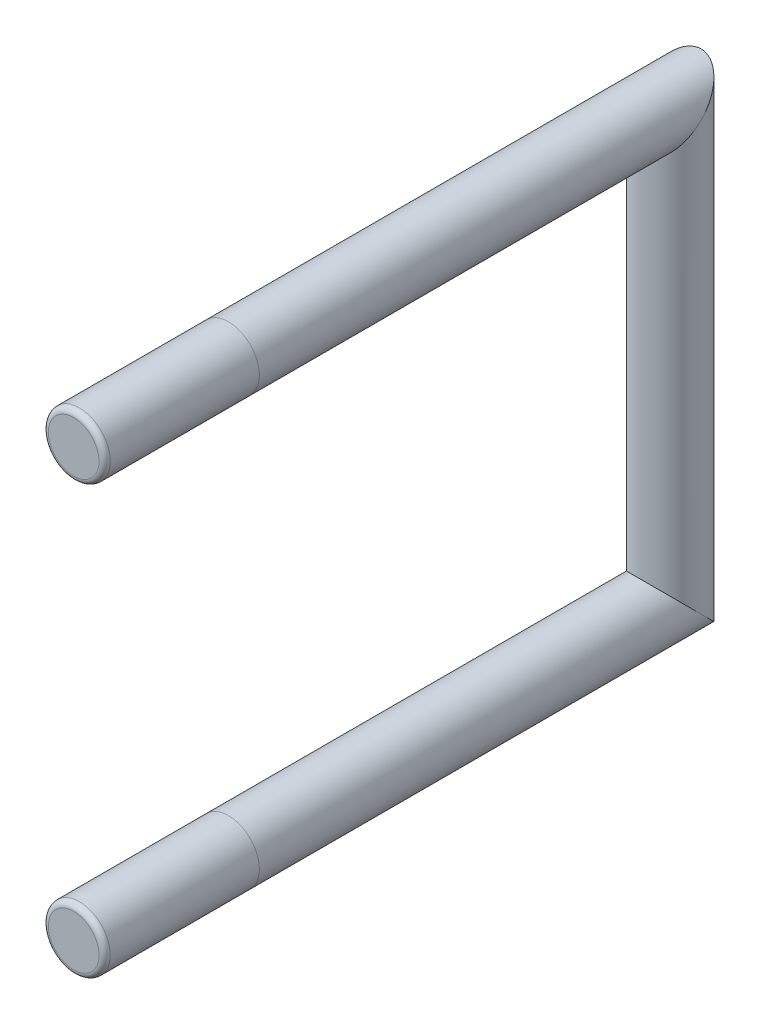
ISO-10303-21;
HEADER;
FILE_DESCRIPTION(('STEP AP214'),'2;1');
FILE_NAME('part.step','',(''),(''),'','','');
FILE_SCHEMA(('AUTOMOTIVE_DESIGN { 1 0 10303 214 1 1 1 1 }'));
ENDSEC;
DATA;
#1=APPLICATION_CONTEXT('core data for automotive mechanical design processes');
#2=APPLICATION_PROTOCOL_DEFINITION('international standard','automotive_design',2000,#1);
#3=PRODUCT_CONTEXT('',#1,'mechanical');
#4=PRODUCT('Part','Part','',(#3));
#5=PRODUCT_RELATED_PRODUCT_CATEGORY('part','',(#4));
#6=PRODUCT_DEFINITION_FORMATION('','',#4);
#7=PRODUCT_DEFINITION_CONTEXT('part definition',#1,'design');
#8=PRODUCT_DEFINITION('design','',#6,#7);
#9=PRODUCT_DEFINITION_SHAPE('','',#8);
#10=(LENGTH_UNIT() NAMED_UNIT(*) SI_UNIT(.MILLI.,.METRE.));
#11=(NAMED_UNIT(*) PLANE_ANGLE_UNIT() SI_UNIT($,.RADIAN.));
#12=(NAMED_UNIT(*) SI_UNIT($,.STERADIAN.) SOLID_ANGLE_UNIT());
#13=UNCERTAINTY_MEASURE_WITH_UNIT(LENGTH_MEASURE(1.E-05),#10,'distance_accuracy_value','');
#14=(GEOMETRIC_REPRESENTATION_CONTEXT(3) GLOBAL_UNCERTAINTY_ASSIGNED_CONTEXT((#13)) GLOBAL_UNIT_ASSIGNED_CONTEXT((#10,
#11,#12)) REPRESENTATION_CONTEXT('',''));
#15=CARTESIAN_POINT('',(0.,0.,0.));
#16=DIRECTION('',(0.,0.,1.));
#17=DIRECTION('',(1.,0.,0.));
#18=AXIS2_PLACEMENT_3D('',#15,#16,#17);
#19=CARTESIAN_POINT('',(0.,152.,0.));
#20=DIRECTION('',(0.,-1.,0.));
#21=DIRECTION('',(0.,0.,-1.));
#22=AXIS2_PLACEMENT_3D('',#19,#20,#21);
#23=CYLINDRICAL_SURFACE('',#22,11.);
#24=CARTESIAN_POINT('',(0.,0.,0.));
#25=DIRECTION('',(0.,0.707106781186547,-0.707106781186547));
#26=DIRECTION('',(0.,-0.707106781186547,-0.707106781186547));
#27=AXIS2_PLACEMENT_3D('',#24,#25,#26);
#28=ELLIPSE('',#27,15.556349186104,11.);
#29=CARTESIAN_POINT('',(-0.104879692967884,-10.9995000000001,-10.9995000000001));
#30=VERTEX_POINT('',#29);
#31=CARTESIAN_POINT('',(0.104879692967882,-10.9995000000001,-10.9995000000001));
#32=VERTEX_POINT('',#31);
#33=EDGE_CURVE('E57',#30,#32,#28,.T.);
#34=ORIENTED_EDGE('',*,*,#33,.T.);
#35=CARTESIAN_POINT('',(0.,-21.9990000000002,0.));
#36=DIRECTION('',(0.,-0.707106781186551,-0.707106781186544));
#37=DIRECTION('',(0.,-0.707106781186544,0.707106781186551));
#38=AXIS2_PLACEMENT_3D('',#35,#36,#37);
#39=ELLIPSE('',#38,15.556349186104,11.);
#40=EDGE_CURVE('E68',#32,#30,#39,.F.);
#41=ORIENTED_EDGE('',*,*,#40,.T.);
#42=EDGE_LOOP('',(#34,#41));
#43=FACE_BOUND('',#42,.T.);
#44=CARTESIAN_POINT('',(0.,152.,0.));
#45=DIRECTION('',(0.,-0.707106781186547,-0.707106781186547));
#46=DIRECTION('',(0.,-0.707106781186547,0.707106781186547));
#47=AXIS2_PLACEMENT_3D('',#44,#45,#46);
#48=ELLIPSE('',#47,15.556349186104,11.);
#49=CARTESIAN_POINT('',(-0.104879692967824,162.9995,-10.9995000000001));
#50=VERTEX_POINT('',#49);
#51=CARTESIAN_POINT('',(0.104879692967745,162.9995,-10.9995000000001));
#52=VERTEX_POINT('',#51);
#53=EDGE_CURVE('E45',#50,#52,#48,.F.);
#54=ORIENTED_EDGE('',*,*,#53,.F.);
#55=CARTESIAN_POINT('',(0.,173.999,0.));
#56=DIRECTION('',(0.,-0.707106781186551,0.707106781186544));
#57=DIRECTION('',(0.,-0.707106781186544,-0.707106781186551));
#58=AXIS2_PLACEMENT_3D('',#55,#56,#57);
#59=ELLIPSE('',#58,15.556349186104,11.);
#60=EDGE_CURVE('E69',#50,#52,#59,.T.);
#61=ORIENTED_EDGE('',*,*,#60,.T.);
#62=EDGE_LOOP('',(#54,#61));
#63=FACE_BOUND('',#62,.T.);
#64=ADVANCED_FACE('F31',(#43,#63),#23,.T.);
#65=CARTESIAN_POINT('',(0.,0.,157.));
#66=DIRECTION('',(0.,0.,-1.));
#67=DIRECTION('',(-1.,0.,0.));
#68=AXIS2_PLACEMENT_3D('',#65,#66,#67);
#69=CYLINDRICAL_SURFACE('',#68,11.);
#70=CARTESIAN_POINT('',(0.,0.,157.));
#71=DIRECTION('',(0.,0.,1.));
#72=DIRECTION('',(1.,0.,0.));
#73=AXIS2_PLACEMENT_3D('',#70,#71,#72);
#74=CIRCLE('',#73,10.9995);
#75=CARTESIAN_POINT('',(10.9995,0.,157.));
#76=VERTEX_POINT('',#75);
#77=EDGE_CURVE('E64',#76,#76,#74,.T.);
#78=ORIENTED_EDGE('',*,*,#77,.F.);
#79=EDGE_LOOP('',(#78));
#80=FACE_BOUND('',#79,.T.);
#81=ORIENTED_EDGE('',*,*,#33,.F.);
#82=CARTESIAN_POINT('',(0.,0.,-21.9990000000004));
#83=DIRECTION('',(0.,-0.707106781186551,-0.707106781186544));
#84=DIRECTION('',(0.,0.707106781186544,-0.707106781186551));
#85=AXIS2_PLACEMENT_3D('',#82,#83,#84);
#86=ELLIPSE('',#85,15.5563491861041,11.);
#87=EDGE_CURVE('E60',#30,#32,#86,.F.);
#88=ORIENTED_EDGE('',*,*,#87,.T.);
#89=EDGE_LOOP('',(#81,#88));
#90=FACE_BOUND('',#89,.T.);
#91=ADVANCED_FACE('F59',(#80,#90),#69,.T.);
#92=CARTESIAN_POINT('',(0.,152.,157.));
#93=DIRECTION('',(0.,0.,-1.));
#94=DIRECTION('',(-1.,0.,0.));
#95=AXIS2_PLACEMENT_3D('',#92,#93,#94);
#96=CYLINDRICAL_SURFACE('',#95,11.);
#97=CARTESIAN_POINT('',(0.,152.,157.));
#98=DIRECTION('',(0.,0.,1.));
#99=DIRECTION('',(1.,0.,0.));
#100=AXIS2_PLACEMENT_3D('',#97,#98,#99);
#101=CIRCLE('',#100,10.9995);
#102=CARTESIAN_POINT('',(10.9995,152.,157.));
#103=VERTEX_POINT('',#102);
#104=EDGE_CURVE('E83',#103,#103,#101,.T.);
#105=ORIENTED_EDGE('',*,*,#104,.F.);
#106=EDGE_LOOP('',(#105));
#107=FACE_BOUND('',#106,.T.);
#108=ORIENTED_EDGE('',*,*,#53,.T.);
#109=CARTESIAN_POINT('',(0.,152.,-21.9990000000004));
#110=DIRECTION('',(0.,-0.707106781186551,0.707106781186544));
#111=DIRECTION('',(0.,-0.707106781186544,-0.707106781186551));
#112=AXIS2_PLACEMENT_3D('',#109,#110,#111);
#113=ELLIPSE('',#112,15.5563491861041,11.);
#114=EDGE_CURVE('E76',#52,#50,#113,.T.);
#115=ORIENTED_EDGE('',*,*,#114,.T.);
#116=EDGE_LOOP('',(#108,#115));
#117=FACE_BOUND('',#116,.T.);
#118=ADVANCED_FACE('F90',(#107,#117),#96,.T.);
#119=CARTESIAN_POINT('',(0.,0.,-21.9990000000004));
#120=DIRECTION('',(0.,-0.707106781186551,-0.707106781186544));
#121=DIRECTION('',(0.,0.707106781186544,-0.707106781186551));
#122=AXIS2_PLACEMENT_3D('',#119,#120,#121);
#123=PLANE('',#122);
#124=ORIENTED_EDGE('',*,*,#40,.F.);
#125=ORIENTED_EDGE('',*,*,#87,.F.);
#126=EDGE_LOOP('',(#124,#125));
#127=FACE_BOUND('',#126,.T.);
#128=ADVANCED_FACE('F67',(#127),#123,.T.);
#129=CARTESIAN_POINT('',(0.,152.,-21.9990000000004));
#130=DIRECTION('',(0.,-0.707106781186551,0.707106781186544));
#131=DIRECTION('',(0.,-0.707106781186544,-0.707106781186551));
#132=AXIS2_PLACEMENT_3D('',#129,#130,#131);
#133=PLANE('',#132);
#134=ORIENTED_EDGE('',*,*,#60,.F.);
#135=ORIENTED_EDGE('',*,*,#114,.F.);
#136=EDGE_LOOP('',(#134,#135));
#137=FACE_BOUND('',#136,.T.);
#138=ADVANCED_FACE('F139',(#137),#133,.F.);
#139=CARTESIAN_POINT('',(0.,152.,212.));
#140=DIRECTION('',(0.,0.,-1.));
#141=DIRECTION('',(-1.,0.,0.));
#142=AXIS2_PLACEMENT_3D('',#139,#140,#141);
#143=CYLINDRICAL_SURFACE('',#142,10.9995);
#144=CARTESIAN_POINT('',(0.,152.,210.));
#145=DIRECTION('',(0.,0.,1.));
#146=DIRECTION('',(1.,0.,0.));
#147=AXIS2_PLACEMENT_3D('',#144,#145,#146);
#148=CIRCLE('',#147,10.9995);
#149=CARTESIAN_POINT('',(10.9995,152.,210.));
#150=VERTEX_POINT('',#149);
#151=EDGE_CURVE('E11',#150,#150,#148,.F.);
#152=ORIENTED_EDGE('',*,*,#151,.T.);
#153=EDGE_LOOP('',(#152));
#154=FACE_BOUND('',#153,.T.);
#155=ORIENTED_EDGE('',*,*,#104,.T.);
#156=EDGE_LOOP('',(#155));
#157=FACE_BOUND('',#156,.T.);
#158=ADVANCED_FACE('F100',(#154,#157),#143,.T.);
#159=CARTESIAN_POINT('',(0.,152.,212.));
#160=DIRECTION('',(0.,0.,1.));
#161=DIRECTION('',(1.,0.,0.));
#162=AXIS2_PLACEMENT_3D('',#159,#160,#161);
#163=PLANE('',#162);
#164=CARTESIAN_POINT('',(0.,152.,212.));
#165=DIRECTION('',(0.,0.,1.));
#166=DIRECTION('',(1.,0.,0.));
#167=AXIS2_PLACEMENT_3D('',#164,#165,#166);
#168=CIRCLE('',#167,8.9995);
#169=CARTESIAN_POINT('',(8.9995,152.,212.));
#170=VERTEX_POINT('',#169);
#171=EDGE_CURVE('E39',#170,#170,#168,.T.);
#172=ORIENTED_EDGE('',*,*,#171,.T.);
#173=EDGE_LOOP('',(#172));
#174=FACE_BOUND('',#173,.T.);
#175=ADVANCED_FACE('F125',(#174),#163,.T.);
#176=CARTESIAN_POINT('',(0.,0.,212.));
#177=DIRECTION('',(0.,0.,-1.));
#178=DIRECTION('',(-1.,0.,0.));
#179=AXIS2_PLACEMENT_3D('',#176,#177,#178);
#180=CYLINDRICAL_SURFACE('',#179,10.9995);
#181=CARTESIAN_POINT('',(0.,0.,210.));
#182=DIRECTION('',(0.,0.,1.));
#183=DIRECTION('',(1.,0.,0.));
#184=AXIS2_PLACEMENT_3D('',#181,#182,#183);
#185=CIRCLE('',#184,10.9995);
#186=CARTESIAN_POINT('',(10.9995,0.,210.));
#187=VERTEX_POINT('',#186);
#188=EDGE_CURVE('E120',#187,#187,#185,.F.);
#189=ORIENTED_EDGE('',*,*,#188,.T.);
#190=EDGE_LOOP('',(#189));
#191=FACE_BOUND('',#190,.T.);
#192=ORIENTED_EDGE('',*,*,#77,.T.);
#193=EDGE_LOOP('',(#192));
#194=FACE_BOUND('',#193,.T.);
#195=ADVANCED_FACE('F154',(#191,#194),#180,.T.);
#196=CARTESIAN_POINT('',(0.,0.,212.));
#197=DIRECTION('',(0.,0.,1.));
#198=DIRECTION('',(1.,0.,0.));
#199=AXIS2_PLACEMENT_3D('',#196,#197,#198);
#200=PLANE('',#199);
#201=CARTESIAN_POINT('',(0.,0.,212.));
#202=DIRECTION('',(0.,0.,1.));
#203=DIRECTION('',(1.,0.,0.));
#204=AXIS2_PLACEMENT_3D('',#201,#202,#203);
#205=CIRCLE('',#204,8.9995);
#206=CARTESIAN_POINT('',(8.9995,0.,212.));
#207=VERTEX_POINT('',#206);
#208=EDGE_CURVE('E78',#207,#207,#205,.T.);
#209=ORIENTED_EDGE('',*,*,#208,.T.);
#210=EDGE_LOOP('',(#209));
#211=FACE_BOUND('',#210,.T.);
#212=ADVANCED_FACE('F133',(#211),#200,.T.);
#213=CARTESIAN_POINT('',(0.,0.,210.));
#214=DIRECTION('',(0.,0.,1.));
#215=DIRECTION('',(1.,0.,0.));
#216=AXIS2_PLACEMENT_3D('',#213,#214,#215);
#217=TOROIDAL_SURFACE('',#216,8.9995,2.);
#218=ORIENTED_EDGE('',*,*,#188,.F.);
#219=EDGE_LOOP('',(#218));
#220=FACE_BOUND('',#219,.T.);
#221=ORIENTED_EDGE('',*,*,#208,.F.);
#222=EDGE_LOOP('',(#221));
#223=FACE_BOUND('',#222,.T.);
#224=ADVANCED_FACE('F128',(#220,#223),#217,.T.);
#225=CARTESIAN_POINT('',(0.,152.,210.));
#226=DIRECTION('',(0.,0.,1.));
#227=DIRECTION('',(1.,0.,0.));
#228=AXIS2_PLACEMENT_3D('',#225,#226,#227);
#229=TOROIDAL_SURFACE('',#228,8.9995,2.);
#230=ORIENTED_EDGE('',*,*,#151,.F.);
#231=EDGE_LOOP('',(#230));
#232=FACE_BOUND('',#231,.T.);
#233=ORIENTED_EDGE('',*,*,#171,.F.);
#234=EDGE_LOOP('',(#233));
#235=FACE_BOUND('',#234,.T.);
#236=ADVANCED_FACE('F33',(#232,#235),#229,.T.);
#237=CLOSED_SHELL('',(#64,#91,#118,#128,#138,#158,#175,#195,#212,#224,#236));
#238=MANIFOLD_SOLID_BREP('B2',#237);
#239=ADVANCED_BREP_SHAPE_REPRESENTATION('',(#18,#238),#14);
#240=SHAPE_DEFINITION_REPRESENTATION(#9,#239);
ENDSEC;
END-ISO-10303-21;
